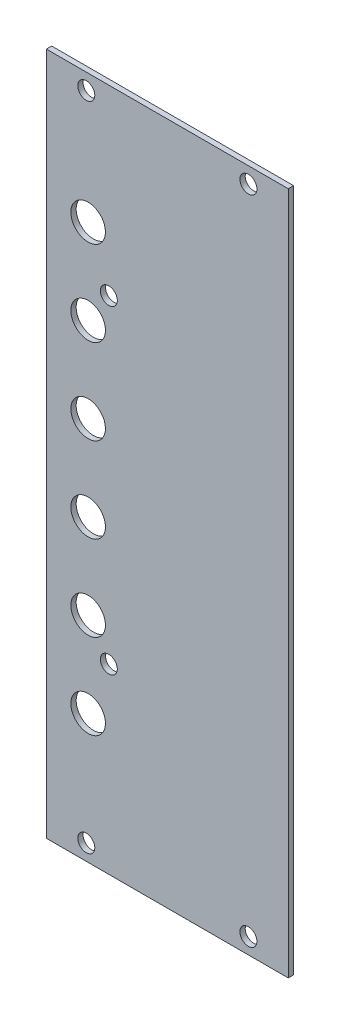
ISO-10303-21;
HEADER;
FILE_DESCRIPTION(('STEP AP214'),'2;1');
FILE_NAME('part.step','',(''),(''),'','','');
FILE_SCHEMA(('AUTOMOTIVE_DESIGN { 1 0 10303 214 1 1 1 1 }'));
ENDSEC;
DATA;
#1=APPLICATION_CONTEXT('core data for automotive mechanical design processes');
#2=APPLICATION_PROTOCOL_DEFINITION('international standard','automotive_design',2000,#1);
#3=PRODUCT_CONTEXT('',#1,'mechanical');
#4=PRODUCT('Part','Part','',(#3));
#5=PRODUCT_RELATED_PRODUCT_CATEGORY('part','',(#4));
#6=PRODUCT_DEFINITION_FORMATION('','',#4);
#7=PRODUCT_DEFINITION_CONTEXT('part definition',#1,'design');
#8=PRODUCT_DEFINITION('design','',#6,#7);
#9=PRODUCT_DEFINITION_SHAPE('','',#8);
#10=(LENGTH_UNIT() NAMED_UNIT(*) SI_UNIT(.MILLI.,.METRE.));
#11=(NAMED_UNIT(*) PLANE_ANGLE_UNIT() SI_UNIT($,.RADIAN.));
#12=(NAMED_UNIT(*) SI_UNIT($,.STERADIAN.) SOLID_ANGLE_UNIT());
#13=UNCERTAINTY_MEASURE_WITH_UNIT(LENGTH_MEASURE(1.E-05),#10,'distance_accuracy_value','');
#14=(GEOMETRIC_REPRESENTATION_CONTEXT(3) GLOBAL_UNCERTAINTY_ASSIGNED_CONTEXT((#13)) GLOBAL_UNIT_ASSIGNED_CONTEXT((#10,
#11,#12)) REPRESENTATION_CONTEXT('',''));
#15=CARTESIAN_POINT('',(0.,0.,0.));
#16=DIRECTION('',(0.,0.,1.));
#17=DIRECTION('',(1.,0.,0.));
#18=AXIS2_PLACEMENT_3D('',#15,#16,#17);
#19=CARTESIAN_POINT('',(0.,0.,1.));
#20=DIRECTION('',(0.,1.,0.));
#21=DIRECTION('',(0.,0.,1.));
#22=AXIS2_PLACEMENT_3D('',#19,#20,#21);
#23=PLANE('',#22);
#24=DIRECTION('',(1.,0.,0.));
#25=VECTOR('',#24,1.);
#26=CARTESIAN_POINT('',(0.,0.,0.));
#27=LINE('',#26,#25);
#28=CARTESIAN_POINT('',(0.,0.,0.));
#29=VERTEX_POINT('',#28);
#30=CARTESIAN_POINT('',(45.48,0.,0.));
#31=VERTEX_POINT('',#30);
#32=EDGE_CURVE('E126',#29,#31,#27,.T.);
#33=ORIENTED_EDGE('',*,*,#32,.T.);
#34=DIRECTION('',(0.,0.,-1.));
#35=VECTOR('',#34,1.);
#36=CARTESIAN_POINT('',(45.48,0.,1.));
#37=LINE('',#36,#35);
#38=CARTESIAN_POINT('',(45.48,0.,1.));
#39=VERTEX_POINT('',#38);
#40=EDGE_CURVE('E11',#39,#31,#37,.T.);
#41=ORIENTED_EDGE('',*,*,#40,.F.);
#42=DIRECTION('',(1.,0.,0.));
#43=VECTOR('',#42,1.);
#44=CARTESIAN_POINT('',(0.,0.,1.));
#45=LINE('',#44,#43);
#46=CARTESIAN_POINT('',(0.,0.,1.));
#47=VERTEX_POINT('',#46);
#48=EDGE_CURVE('E91',#47,#39,#45,.T.);
#49=ORIENTED_EDGE('',*,*,#48,.F.);
#50=DIRECTION('',(0.,0.,-1.));
#51=VECTOR('',#50,1.);
#52=CARTESIAN_POINT('',(0.,0.,1.));
#53=LINE('',#52,#51);
#54=EDGE_CURVE('E58',#47,#29,#53,.T.);
#55=ORIENTED_EDGE('',*,*,#54,.T.);
#56=EDGE_LOOP('',(#33,#41,#49,#55));
#57=FACE_BOUND('',#56,.T.);
#58=ADVANCED_FACE('F40',(#57),#23,.F.);
#59=CARTESIAN_POINT('',(45.48,0.,1.));
#60=DIRECTION('',(-1.,0.,0.));
#61=DIRECTION('',(0.,0.,1.));
#62=AXIS2_PLACEMENT_3D('',#59,#60,#61);
#63=PLANE('',#62);
#64=DIRECTION('',(0.,1.,0.));
#65=VECTOR('',#64,1.);
#66=CARTESIAN_POINT('',(45.48,0.,0.));
#67=LINE('',#66,#65);
#68=CARTESIAN_POINT('',(45.48,128.5,0.));
#69=VERTEX_POINT('',#68);
#70=EDGE_CURVE('E97',#31,#69,#67,.T.);
#71=ORIENTED_EDGE('',*,*,#70,.T.);
#72=DIRECTION('',(0.,0.,-1.));
#73=VECTOR('',#72,1.);
#74=CARTESIAN_POINT('',(45.48,128.5,1.));
#75=LINE('',#74,#73);
#76=CARTESIAN_POINT('',(45.48,128.5,1.));
#77=VERTEX_POINT('',#76);
#78=EDGE_CURVE('E50',#77,#69,#75,.T.);
#79=ORIENTED_EDGE('',*,*,#78,.F.);
#80=DIRECTION('',(0.,1.,0.));
#81=VECTOR('',#80,1.);
#82=CARTESIAN_POINT('',(45.48,0.,1.));
#83=LINE('',#82,#81);
#84=EDGE_CURVE('E83',#39,#77,#83,.T.);
#85=ORIENTED_EDGE('',*,*,#84,.F.);
#86=ORIENTED_EDGE('',*,*,#40,.T.);
#87=EDGE_LOOP('',(#71,#79,#85,#86));
#88=FACE_BOUND('',#87,.T.);
#89=ADVANCED_FACE('F96',(#88),#63,.F.);
#90=CARTESIAN_POINT('',(0.,128.5,1.));
#91=DIRECTION('',(0.,1.,0.));
#92=DIRECTION('',(0.,0.,1.));
#93=AXIS2_PLACEMENT_3D('',#90,#91,#92);
#94=PLANE('',#93);
#95=DIRECTION('',(1.,0.,0.));
#96=VECTOR('',#95,1.);
#97=CARTESIAN_POINT('',(0.,128.5,0.));
#98=LINE('',#97,#96);
#99=CARTESIAN_POINT('',(0.,128.5,0.));
#100=VERTEX_POINT('',#99);
#101=EDGE_CURVE('E131',#100,#69,#98,.T.);
#102=ORIENTED_EDGE('',*,*,#101,.F.);
#103=DIRECTION('',(0.,0.,-1.));
#104=VECTOR('',#103,1.);
#105=CARTESIAN_POINT('',(0.,128.5,1.));
#106=LINE('',#105,#104);
#107=CARTESIAN_POINT('',(0.,128.5,1.));
#108=VERTEX_POINT('',#107);
#109=EDGE_CURVE('E72',#108,#100,#106,.T.);
#110=ORIENTED_EDGE('',*,*,#109,.F.);
#111=DIRECTION('',(1.,0.,0.));
#112=VECTOR('',#111,1.);
#113=CARTESIAN_POINT('',(0.,128.5,1.));
#114=LINE('',#113,#112);
#115=EDGE_CURVE('E90',#108,#77,#114,.T.);
#116=ORIENTED_EDGE('',*,*,#115,.T.);
#117=ORIENTED_EDGE('',*,*,#78,.T.);
#118=EDGE_LOOP('',(#102,#110,#116,#117));
#119=FACE_BOUND('',#118,.T.);
#120=ADVANCED_FACE('F101',(#119),#94,.T.);
#121=CARTESIAN_POINT('',(7.49999999999999,125.5,1.));
#122=DIRECTION('',(0.,0.,-1.));
#123=DIRECTION('',(-1.,0.,0.));
#124=AXIS2_PLACEMENT_3D('',#121,#122,#123);
#125=CYLINDRICAL_SURFACE('',#124,1.6);
#126=CARTESIAN_POINT('',(7.49999999999999,125.5,1.));
#127=DIRECTION('',(0.,0.,1.));
#128=DIRECTION('',(1.,0.,0.));
#129=AXIS2_PLACEMENT_3D('',#126,#127,#128);
#130=CIRCLE('',#129,1.6);
#131=CARTESIAN_POINT('',(9.09999999999999,125.5,1.));
#132=VERTEX_POINT('',#131);
#133=EDGE_CURVE('E159',#132,#132,#130,.T.);
#134=ORIENTED_EDGE('',*,*,#133,.T.);
#135=EDGE_LOOP('',(#134));
#136=FACE_BOUND('',#135,.T.);
#137=CARTESIAN_POINT('',(7.49999999999999,125.5,0.));
#138=DIRECTION('',(0.,0.,1.));
#139=DIRECTION('',(1.,0.,0.));
#140=AXIS2_PLACEMENT_3D('',#137,#138,#139);
#141=CIRCLE('',#140,1.6);
#142=CARTESIAN_POINT('',(9.09999999999999,125.5,0.));
#143=VERTEX_POINT('',#142);
#144=EDGE_CURVE('E122',#143,#143,#141,.T.);
#145=ORIENTED_EDGE('',*,*,#144,.F.);
#146=EDGE_LOOP('',(#145));
#147=FACE_BOUND('',#146,.T.);
#148=ADVANCED_FACE('F165',(#136,#147),#125,.F.);
#149=CARTESIAN_POINT('',(37.98,125.5,1.));
#150=DIRECTION('',(0.,0.,-1.));
#151=DIRECTION('',(-1.,0.,0.));
#152=AXIS2_PLACEMENT_3D('',#149,#150,#151);
#153=CYLINDRICAL_SURFACE('',#152,1.6);
#154=CARTESIAN_POINT('',(37.98,125.5,1.));
#155=DIRECTION('',(0.,0.,1.));
#156=DIRECTION('',(1.,0.,0.));
#157=AXIS2_PLACEMENT_3D('',#154,#155,#156);
#158=CIRCLE('',#157,1.6);
#159=CARTESIAN_POINT('',(39.58,125.5,1.));
#160=VERTEX_POINT('',#159);
#161=EDGE_CURVE('E151',#160,#160,#158,.T.);
#162=ORIENTED_EDGE('',*,*,#161,.T.);
#163=EDGE_LOOP('',(#162));
#164=FACE_BOUND('',#163,.T.);
#165=CARTESIAN_POINT('',(37.98,125.5,0.));
#166=DIRECTION('',(0.,0.,1.));
#167=DIRECTION('',(1.,0.,0.));
#168=AXIS2_PLACEMENT_3D('',#165,#166,#167);
#169=CIRCLE('',#168,1.6);
#170=CARTESIAN_POINT('',(39.58,125.5,0.));
#171=VERTEX_POINT('',#170);
#172=EDGE_CURVE('E118',#171,#171,#169,.T.);
#173=ORIENTED_EDGE('',*,*,#172,.F.);
#174=EDGE_LOOP('',(#173));
#175=FACE_BOUND('',#174,.T.);
#176=ADVANCED_FACE('F195',(#164,#175),#153,.F.);
#177=CARTESIAN_POINT('',(37.98,3.,1.));
#178=DIRECTION('',(0.,0.,-1.));
#179=DIRECTION('',(-1.,0.,0.));
#180=AXIS2_PLACEMENT_3D('',#177,#178,#179);
#181=CYLINDRICAL_SURFACE('',#180,1.60000000000001);
#182=CARTESIAN_POINT('',(37.98,3.,1.));
#183=DIRECTION('',(0.,0.,1.));
#184=DIRECTION('',(1.,0.,0.));
#185=AXIS2_PLACEMENT_3D('',#182,#183,#184);
#186=CIRCLE('',#185,1.60000000000001);
#187=CARTESIAN_POINT('',(39.58,3.,1.));
#188=VERTEX_POINT('',#187);
#189=EDGE_CURVE('E145',#188,#188,#186,.T.);
#190=ORIENTED_EDGE('',*,*,#189,.T.);
#191=EDGE_LOOP('',(#190));
#192=FACE_BOUND('',#191,.T.);
#193=CARTESIAN_POINT('',(37.98,3.,0.));
#194=DIRECTION('',(0.,0.,1.));
#195=DIRECTION('',(1.,0.,0.));
#196=AXIS2_PLACEMENT_3D('',#193,#194,#195);
#197=CIRCLE('',#196,1.60000000000001);
#198=CARTESIAN_POINT('',(39.58,3.,0.));
#199=VERTEX_POINT('',#198);
#200=EDGE_CURVE('E113',#199,#199,#197,.T.);
#201=ORIENTED_EDGE('',*,*,#200,.F.);
#202=EDGE_LOOP('',(#201));
#203=FACE_BOUND('',#202,.T.);
#204=ADVANCED_FACE('F197',(#192,#203),#181,.F.);
#205=CARTESIAN_POINT('',(7.50000000000001,3.,1.));
#206=DIRECTION('',(0.,0.,-1.));
#207=DIRECTION('',(-1.,0.,0.));
#208=AXIS2_PLACEMENT_3D('',#205,#206,#207);
#209=CYLINDRICAL_SURFACE('',#208,1.6);
#210=CARTESIAN_POINT('',(7.50000000000001,3.,1.));
#211=DIRECTION('',(0.,0.,1.));
#212=DIRECTION('',(1.,0.,0.));
#213=AXIS2_PLACEMENT_3D('',#210,#211,#212);
#214=CIRCLE('',#213,1.6);
#215=CARTESIAN_POINT('',(9.10000000000001,3.,1.));
#216=VERTEX_POINT('',#215);
#217=EDGE_CURVE('E138',#216,#216,#214,.T.);
#218=ORIENTED_EDGE('',*,*,#217,.T.);
#219=EDGE_LOOP('',(#218));
#220=FACE_BOUND('',#219,.T.);
#221=CARTESIAN_POINT('',(7.50000000000001,3.,0.));
#222=DIRECTION('',(0.,0.,1.));
#223=DIRECTION('',(1.,0.,0.));
#224=AXIS2_PLACEMENT_3D('',#221,#222,#223);
#225=CIRCLE('',#224,1.6);
#226=CARTESIAN_POINT('',(9.10000000000001,3.,0.));
#227=VERTEX_POINT('',#226);
#228=EDGE_CURVE('E109',#227,#227,#225,.T.);
#229=ORIENTED_EDGE('',*,*,#228,.F.);
#230=EDGE_LOOP('',(#229));
#231=FACE_BOUND('',#230,.T.);
#232=ADVANCED_FACE('F42',(#220,#231),#209,.F.);
#233=CARTESIAN_POINT('',(0.,0.,1.));
#234=DIRECTION('',(-1.,0.,0.));
#235=DIRECTION('',(0.,0.,1.));
#236=AXIS2_PLACEMENT_3D('',#233,#234,#235);
#237=PLANE('',#236);
#238=DIRECTION('',(0.,1.,0.));
#239=VECTOR('',#238,1.);
#240=CARTESIAN_POINT('',(0.,0.,0.));
#241=LINE('',#240,#239);
#242=EDGE_CURVE('E134',#29,#100,#241,.T.);
#243=ORIENTED_EDGE('',*,*,#242,.F.);
#244=ORIENTED_EDGE('',*,*,#54,.F.);
#245=DIRECTION('',(0.,1.,0.));
#246=VECTOR('',#245,1.);
#247=CARTESIAN_POINT('',(0.,0.,1.));
#248=LINE('',#247,#246);
#249=EDGE_CURVE('E103',#47,#108,#248,.T.);
#250=ORIENTED_EDGE('',*,*,#249,.T.);
#251=ORIENTED_EDGE('',*,*,#109,.T.);
#252=EDGE_LOOP('',(#243,#244,#250,#251));
#253=FACE_BOUND('',#252,.T.);
#254=ADVANCED_FACE('F170',(#253),#237,.T.);
#255=CARTESIAN_POINT('',(0.,0.,1.));
#256=DIRECTION('',(0.,0.,1.));
#257=DIRECTION('',(1.,0.,0.));
#258=AXIS2_PLACEMENT_3D('',#255,#256,#257);
#259=PLANE('',#258);
#260=CARTESIAN_POINT('',(11.7314000000001,94.225,1.));
#261=DIRECTION('',(0.,0.,1.));
#262=DIRECTION('',(1.,0.,0.));
#263=AXIS2_PLACEMENT_3D('',#260,#261,#262);
#264=CIRCLE('',#263,1.6);
#265=CARTESIAN_POINT('',(13.3314000000001,94.225,1.));
#266=VERTEX_POINT('',#265);
#267=EDGE_CURVE('E316',#266,#266,#264,.T.);
#268=ORIENTED_EDGE('',*,*,#267,.F.);
#269=EDGE_LOOP('',(#268));
#270=FACE_BOUND('',#269,.T.);
#271=CARTESIAN_POINT('',(11.7314000000001,34.225,1.));
#272=DIRECTION('',(0.,0.,1.));
#273=DIRECTION('',(1.,0.,0.));
#274=AXIS2_PLACEMENT_3D('',#271,#272,#273);
#275=CIRCLE('',#274,1.6);
#276=CARTESIAN_POINT('',(13.3314000000001,34.225,1.));
#277=VERTEX_POINT('',#276);
#278=EDGE_CURVE('E321',#277,#277,#275,.T.);
#279=ORIENTED_EDGE('',*,*,#278,.F.);
#280=EDGE_LOOP('',(#279));
#281=FACE_BOUND('',#280,.T.);
#282=CARTESIAN_POINT('',(7.85000000000007,104.25,1.));
#283=DIRECTION('',(0.,0.,1.));
#284=DIRECTION('',(1.,0.,0.));
#285=AXIS2_PLACEMENT_3D('',#282,#283,#284);
#286=CIRCLE('',#285,3.25);
#287=CARTESIAN_POINT('',(11.1000000000001,104.25,1.));
#288=VERTEX_POINT('',#287);
#289=EDGE_CURVE('E114',#288,#288,#286,.T.);
#290=ORIENTED_EDGE('',*,*,#289,.F.);
#291=EDGE_LOOP('',(#290));
#292=FACE_BOUND('',#291,.T.);
#293=CARTESIAN_POINT('',(7.85000000000024,88.25,1.));
#294=DIRECTION('',(0.,0.,1.));
#295=DIRECTION('',(1.,0.,0.));
#296=AXIS2_PLACEMENT_3D('',#293,#294,#295);
#297=CIRCLE('',#296,3.25);
#298=CARTESIAN_POINT('',(11.1000000000002,88.25,1.));
#299=VERTEX_POINT('',#298);
#300=EDGE_CURVE('E372',#299,#299,#297,.T.);
#301=ORIENTED_EDGE('',*,*,#300,.F.);
#302=EDGE_LOOP('',(#301));
#303=FACE_BOUND('',#302,.T.);
#304=CARTESIAN_POINT('',(7.8500000000004,72.25,1.));
#305=DIRECTION('',(0.,0.,1.));
#306=DIRECTION('',(1.,0.,0.));
#307=AXIS2_PLACEMENT_3D('',#304,#305,#306);
#308=CIRCLE('',#307,3.25);
#309=CARTESIAN_POINT('',(11.1000000000004,72.25,1.));
#310=VERTEX_POINT('',#309);
#311=EDGE_CURVE('E369',#310,#310,#308,.T.);
#312=ORIENTED_EDGE('',*,*,#311,.F.);
#313=EDGE_LOOP('',(#312));
#314=FACE_BOUND('',#313,.T.);
#315=CARTESIAN_POINT('',(7.85000000000057,56.25,1.));
#316=DIRECTION('',(0.,0.,1.));
#317=DIRECTION('',(1.,0.,0.));
#318=AXIS2_PLACEMENT_3D('',#315,#316,#317);
#319=CIRCLE('',#318,3.25);
#320=CARTESIAN_POINT('',(11.1000000000006,56.25,1.));
#321=VERTEX_POINT('',#320);
#322=EDGE_CURVE('E365',#321,#321,#319,.T.);
#323=ORIENTED_EDGE('',*,*,#322,.F.);
#324=EDGE_LOOP('',(#323));
#325=FACE_BOUND('',#324,.T.);
#326=CARTESIAN_POINT('',(7.85000000000074,40.25,1.));
#327=DIRECTION('',(0.,0.,1.));
#328=DIRECTION('',(1.,0.,0.));
#329=AXIS2_PLACEMENT_3D('',#326,#327,#328);
#330=CIRCLE('',#329,3.25);
#331=CARTESIAN_POINT('',(11.1000000000007,40.25,1.));
#332=VERTEX_POINT('',#331);
#333=EDGE_CURVE('E361',#332,#332,#330,.T.);
#334=ORIENTED_EDGE('',*,*,#333,.F.);
#335=EDGE_LOOP('',(#334));
#336=FACE_BOUND('',#335,.T.);
#337=CARTESIAN_POINT('',(7.8500000000009,24.25,1.));
#338=DIRECTION('',(0.,0.,1.));
#339=DIRECTION('',(1.,0.,0.));
#340=AXIS2_PLACEMENT_3D('',#337,#338,#339);
#341=CIRCLE('',#340,3.25);
#342=CARTESIAN_POINT('',(11.1000000000009,24.25,1.));
#343=VERTEX_POINT('',#342);
#344=EDGE_CURVE('E338',#343,#343,#341,.T.);
#345=ORIENTED_EDGE('',*,*,#344,.F.);
#346=EDGE_LOOP('',(#345));
#347=FACE_BOUND('',#346,.T.);
#348=ORIENTED_EDGE('',*,*,#217,.F.);
#349=EDGE_LOOP('',(#348));
#350=FACE_BOUND('',#349,.T.);
#351=ORIENTED_EDGE('',*,*,#189,.F.);
#352=EDGE_LOOP('',(#351));
#353=FACE_BOUND('',#352,.T.);
#354=ORIENTED_EDGE('',*,*,#161,.F.);
#355=EDGE_LOOP('',(#354));
#356=FACE_BOUND('',#355,.T.);
#357=ORIENTED_EDGE('',*,*,#133,.F.);
#358=EDGE_LOOP('',(#357));
#359=FACE_BOUND('',#358,.T.);
#360=ORIENTED_EDGE('',*,*,#48,.T.);
#361=ORIENTED_EDGE('',*,*,#84,.T.);
#362=ORIENTED_EDGE('',*,*,#115,.F.);
#363=ORIENTED_EDGE('',*,*,#249,.F.);
#364=EDGE_LOOP('',(#360,#361,#362,#363));
#365=FACE_BOUND('',#364,.T.);
#366=ADVANCED_FACE('F87',(#270,#281,#292,#303,#314,#325,#336,#347,#350,#353,#356,#359,#365),
#259,.T.);
#367=CARTESIAN_POINT('',(0.,0.,0.));
#368=DIRECTION('',(0.,0.,1.));
#369=DIRECTION('',(1.,0.,0.));
#370=AXIS2_PLACEMENT_3D('',#367,#368,#369);
#371=PLANE('',#370);
#372=CARTESIAN_POINT('',(11.7314000000001,94.225,0.));
#373=DIRECTION('',(0.,0.,1.));
#374=DIRECTION('',(1.,0.,0.));
#375=AXIS2_PLACEMENT_3D('',#372,#373,#374);
#376=CIRCLE('',#375,1.6);
#377=CARTESIAN_POINT('',(13.3314000000001,94.225,0.));
#378=VERTEX_POINT('',#377);
#379=EDGE_CURVE('E319',#378,#378,#376,.T.);
#380=ORIENTED_EDGE('',*,*,#379,.T.);
#381=EDGE_LOOP('',(#380));
#382=FACE_BOUND('',#381,.T.);
#383=CARTESIAN_POINT('',(11.7314000000001,34.225,0.));
#384=DIRECTION('',(0.,0.,1.));
#385=DIRECTION('',(1.,0.,0.));
#386=AXIS2_PLACEMENT_3D('',#383,#384,#385);
#387=CIRCLE('',#386,1.6);
#388=CARTESIAN_POINT('',(13.3314000000001,34.225,0.));
#389=VERTEX_POINT('',#388);
#390=EDGE_CURVE('E322',#389,#389,#387,.T.);
#391=ORIENTED_EDGE('',*,*,#390,.T.);
#392=EDGE_LOOP('',(#391));
#393=FACE_BOUND('',#392,.T.);
#394=CARTESIAN_POINT('',(7.85000000000007,104.25,0.));
#395=DIRECTION('',(0.,0.,1.));
#396=DIRECTION('',(1.,0.,0.));
#397=AXIS2_PLACEMENT_3D('',#394,#395,#396);
#398=CIRCLE('',#397,3.25);
#399=CARTESIAN_POINT('',(11.1000000000001,104.25,0.));
#400=VERTEX_POINT('',#399);
#401=EDGE_CURVE('E334',#400,#400,#398,.T.);
#402=ORIENTED_EDGE('',*,*,#401,.T.);
#403=EDGE_LOOP('',(#402));
#404=FACE_BOUND('',#403,.T.);
#405=CARTESIAN_POINT('',(7.85000000000024,88.25,0.));
#406=DIRECTION('',(0.,0.,1.));
#407=DIRECTION('',(1.,0.,0.));
#408=AXIS2_PLACEMENT_3D('',#405,#406,#407);
#409=CIRCLE('',#408,3.25);
#410=CARTESIAN_POINT('',(11.1000000000002,88.25,0.));
#411=VERTEX_POINT('',#410);
#412=EDGE_CURVE('E339',#411,#411,#409,.T.);
#413=ORIENTED_EDGE('',*,*,#412,.T.);
#414=EDGE_LOOP('',(#413));
#415=FACE_BOUND('',#414,.T.);
#416=CARTESIAN_POINT('',(7.8500000000004,72.25,0.));
#417=DIRECTION('',(0.,0.,1.));
#418=DIRECTION('',(1.,0.,0.));
#419=AXIS2_PLACEMENT_3D('',#416,#417,#418);
#420=CIRCLE('',#419,3.25);
#421=CARTESIAN_POINT('',(11.1000000000004,72.25,0.));
#422=VERTEX_POINT('',#421);
#423=EDGE_CURVE('E343',#422,#422,#420,.T.);
#424=ORIENTED_EDGE('',*,*,#423,.T.);
#425=EDGE_LOOP('',(#424));
#426=FACE_BOUND('',#425,.T.);
#427=CARTESIAN_POINT('',(7.85000000000057,56.25,0.));
#428=DIRECTION('',(0.,0.,1.));
#429=DIRECTION('',(1.,0.,0.));
#430=AXIS2_PLACEMENT_3D('',#427,#428,#429);
#431=CIRCLE('',#430,3.25);
#432=CARTESIAN_POINT('',(11.1000000000006,56.25,0.));
#433=VERTEX_POINT('',#432);
#434=EDGE_CURVE('E347',#433,#433,#431,.T.);
#435=ORIENTED_EDGE('',*,*,#434,.T.);
#436=EDGE_LOOP('',(#435));
#437=FACE_BOUND('',#436,.T.);
#438=CARTESIAN_POINT('',(7.85000000000074,40.25,0.));
#439=DIRECTION('',(0.,0.,1.));
#440=DIRECTION('',(1.,0.,0.));
#441=AXIS2_PLACEMENT_3D('',#438,#439,#440);
#442=CIRCLE('',#441,3.25);
#443=CARTESIAN_POINT('',(11.1000000000007,40.25,0.));
#444=VERTEX_POINT('',#443);
#445=EDGE_CURVE('E351',#444,#444,#442,.T.);
#446=ORIENTED_EDGE('',*,*,#445,.T.);
#447=EDGE_LOOP('',(#446));
#448=FACE_BOUND('',#447,.T.);
#449=CARTESIAN_POINT('',(7.8500000000009,24.25,0.));
#450=DIRECTION('',(0.,0.,1.));
#451=DIRECTION('',(1.,0.,0.));
#452=AXIS2_PLACEMENT_3D('',#449,#450,#451);
#453=CIRCLE('',#452,3.25);
#454=CARTESIAN_POINT('',(11.1000000000009,24.25,0.));
#455=VERTEX_POINT('',#454);
#456=EDGE_CURVE('E333',#455,#455,#453,.T.);
#457=ORIENTED_EDGE('',*,*,#456,.T.);
#458=EDGE_LOOP('',(#457));
#459=FACE_BOUND('',#458,.T.);
#460=ORIENTED_EDGE('',*,*,#228,.T.);
#461=EDGE_LOOP('',(#460));
#462=FACE_BOUND('',#461,.T.);
#463=ORIENTED_EDGE('',*,*,#200,.T.);
#464=EDGE_LOOP('',(#463));
#465=FACE_BOUND('',#464,.T.);
#466=ORIENTED_EDGE('',*,*,#172,.T.);
#467=EDGE_LOOP('',(#466));
#468=FACE_BOUND('',#467,.T.);
#469=ORIENTED_EDGE('',*,*,#144,.T.);
#470=EDGE_LOOP('',(#469));
#471=FACE_BOUND('',#470,.T.);
#472=ORIENTED_EDGE('',*,*,#32,.F.);
#473=ORIENTED_EDGE('',*,*,#242,.T.);
#474=ORIENTED_EDGE('',*,*,#101,.T.);
#475=ORIENTED_EDGE('',*,*,#70,.F.);
#476=EDGE_LOOP('',(#472,#473,#474,#475));
#477=FACE_BOUND('',#476,.T.);
#478=ADVANCED_FACE('F169',(#382,#393,#404,#415,#426,#437,#448,#459,#462,#465,#468,#471,#477),
#371,.F.);
#479=CARTESIAN_POINT('',(7.8500000000009,24.25,0.));
#480=DIRECTION('',(0.,0.,1.));
#481=DIRECTION('',(1.,0.,0.));
#482=AXIS2_PLACEMENT_3D('',#479,#480,#481);
#483=CYLINDRICAL_SURFACE('',#482,3.25);
#484=ORIENTED_EDGE('',*,*,#344,.T.);
#485=EDGE_LOOP('',(#484));
#486=FACE_BOUND('',#485,.T.);
#487=ORIENTED_EDGE('',*,*,#456,.F.);
#488=EDGE_LOOP('',(#487));
#489=FACE_BOUND('',#488,.T.);
#490=ADVANCED_FACE('F177',(#486,#489),#483,.F.);
#491=CARTESIAN_POINT('',(7.85000000000074,40.25,0.));
#492=DIRECTION('',(0.,0.,1.));
#493=DIRECTION('',(1.,0.,0.));
#494=AXIS2_PLACEMENT_3D('',#491,#492,#493);
#495=CYLINDRICAL_SURFACE('',#494,3.25);
#496=ORIENTED_EDGE('',*,*,#333,.T.);
#497=EDGE_LOOP('',(#496));
#498=FACE_BOUND('',#497,.T.);
#499=ORIENTED_EDGE('',*,*,#445,.F.);
#500=EDGE_LOOP('',(#499));
#501=FACE_BOUND('',#500,.T.);
#502=ADVANCED_FACE('F243',(#498,#501),#495,.F.);
#503=CARTESIAN_POINT('',(7.85000000000057,56.25,0.));
#504=DIRECTION('',(0.,0.,1.));
#505=DIRECTION('',(1.,0.,0.));
#506=AXIS2_PLACEMENT_3D('',#503,#504,#505);
#507=CYLINDRICAL_SURFACE('',#506,3.25);
#508=ORIENTED_EDGE('',*,*,#322,.T.);
#509=EDGE_LOOP('',(#508));
#510=FACE_BOUND('',#509,.T.);
#511=ORIENTED_EDGE('',*,*,#434,.F.);
#512=EDGE_LOOP('',(#511));
#513=FACE_BOUND('',#512,.T.);
#514=ADVANCED_FACE('F249',(#510,#513),#507,.F.);
#515=CARTESIAN_POINT('',(7.8500000000004,72.25,0.));
#516=DIRECTION('',(0.,0.,1.));
#517=DIRECTION('',(1.,0.,0.));
#518=AXIS2_PLACEMENT_3D('',#515,#516,#517);
#519=CYLINDRICAL_SURFACE('',#518,3.25);
#520=ORIENTED_EDGE('',*,*,#311,.T.);
#521=EDGE_LOOP('',(#520));
#522=FACE_BOUND('',#521,.T.);
#523=ORIENTED_EDGE('',*,*,#423,.F.);
#524=EDGE_LOOP('',(#523));
#525=FACE_BOUND('',#524,.T.);
#526=ADVANCED_FACE('F257',(#522,#525),#519,.F.);
#527=CARTESIAN_POINT('',(7.85000000000024,88.25,0.));
#528=DIRECTION('',(0.,0.,1.));
#529=DIRECTION('',(1.,0.,0.));
#530=AXIS2_PLACEMENT_3D('',#527,#528,#529);
#531=CYLINDRICAL_SURFACE('',#530,3.25);
#532=ORIENTED_EDGE('',*,*,#300,.T.);
#533=EDGE_LOOP('',(#532));
#534=FACE_BOUND('',#533,.T.);
#535=ORIENTED_EDGE('',*,*,#412,.F.);
#536=EDGE_LOOP('',(#535));
#537=FACE_BOUND('',#536,.T.);
#538=ADVANCED_FACE('F265',(#534,#537),#531,.F.);
#539=CARTESIAN_POINT('',(7.85000000000007,104.25,0.));
#540=DIRECTION('',(0.,0.,1.));
#541=DIRECTION('',(1.,0.,0.));
#542=AXIS2_PLACEMENT_3D('',#539,#540,#541);
#543=CYLINDRICAL_SURFACE('',#542,3.25);
#544=ORIENTED_EDGE('',*,*,#289,.T.);
#545=EDGE_LOOP('',(#544));
#546=FACE_BOUND('',#545,.T.);
#547=ORIENTED_EDGE('',*,*,#401,.F.);
#548=EDGE_LOOP('',(#547));
#549=FACE_BOUND('',#548,.T.);
#550=ADVANCED_FACE('F273',(#546,#549),#543,.F.);
#551=CARTESIAN_POINT('',(11.7314000000001,34.225,0.));
#552=DIRECTION('',(0.,0.,1.));
#553=DIRECTION('',(1.,0.,0.));
#554=AXIS2_PLACEMENT_3D('',#551,#552,#553);
#555=CYLINDRICAL_SURFACE('',#554,1.6);
#556=ORIENTED_EDGE('',*,*,#278,.T.);
#557=EDGE_LOOP('',(#556));
#558=FACE_BOUND('',#557,.T.);
#559=ORIENTED_EDGE('',*,*,#390,.F.);
#560=EDGE_LOOP('',(#559));
#561=FACE_BOUND('',#560,.T.);
#562=ADVANCED_FACE('F280',(#558,#561),#555,.F.);
#563=CARTESIAN_POINT('',(11.7314000000001,94.225,0.));
#564=DIRECTION('',(0.,0.,1.));
#565=DIRECTION('',(1.,0.,0.));
#566=AXIS2_PLACEMENT_3D('',#563,#564,#565);
#567=CYLINDRICAL_SURFACE('',#566,1.6);
#568=ORIENTED_EDGE('',*,*,#267,.T.);
#569=EDGE_LOOP('',(#568));
#570=FACE_BOUND('',#569,.T.);
#571=ORIENTED_EDGE('',*,*,#379,.F.);
#572=EDGE_LOOP('',(#571));
#573=FACE_BOUND('',#572,.T.);
#574=ADVANCED_FACE('F287',(#570,#573),#567,.F.);
#575=CLOSED_SHELL('',(#58,#89,#120,#148,#176,#204,#232,#254,#366,#478,#490,#502,#514,#526,#538,
#550,#562,#574));
#576=MANIFOLD_SOLID_BREP('B2',#575);
#577=ADVANCED_BREP_SHAPE_REPRESENTATION('',(#18,#576),#14);
#578=SHAPE_DEFINITION_REPRESENTATION(#9,#577);
ENDSEC;
END-ISO-10303-21;
